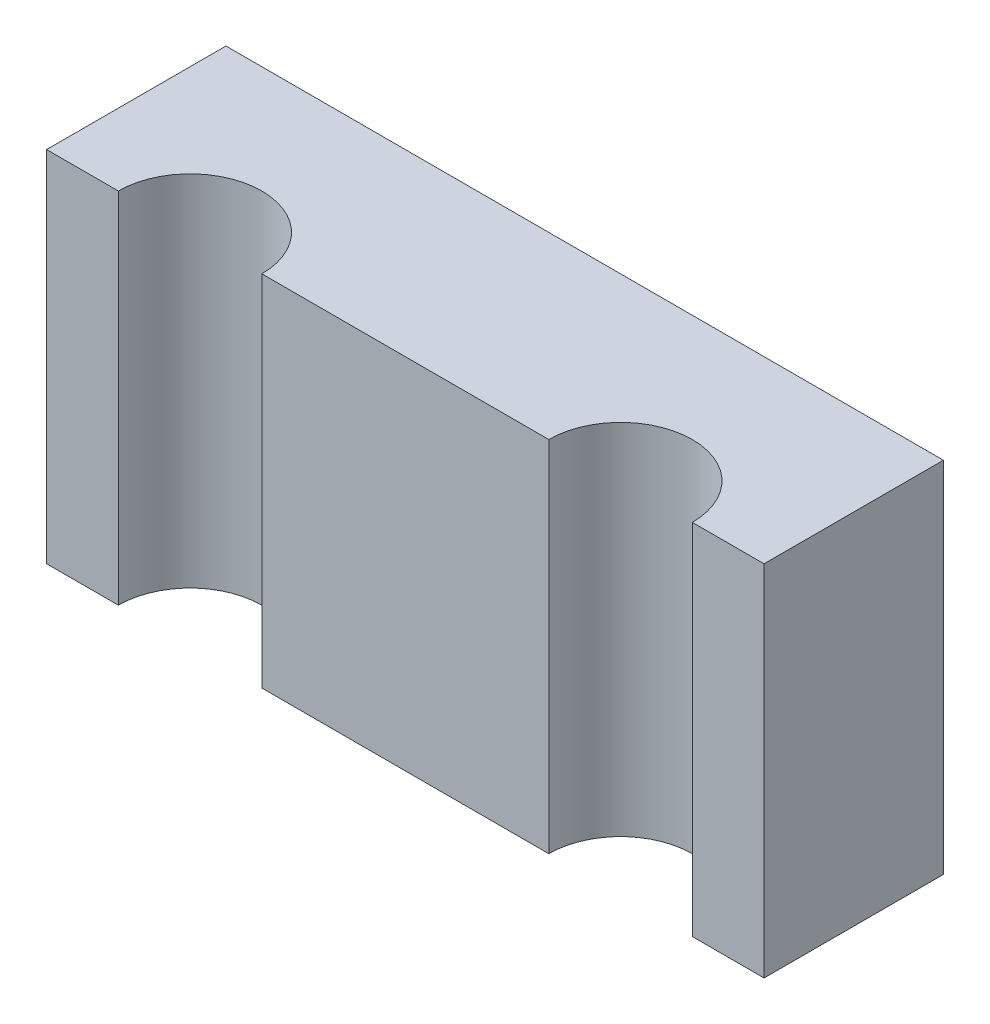
ISO-10303-21;
HEADER;
FILE_DESCRIPTION(('STEP AP214'),'2;1');
FILE_NAME('part.step','',(''),(''),'','','');
FILE_SCHEMA(('AUTOMOTIVE_DESIGN { 1 0 10303 214 1 1 1 1 }'));
ENDSEC;
DATA;
#1=APPLICATION_CONTEXT('core data for automotive mechanical design processes');
#2=APPLICATION_PROTOCOL_DEFINITION('international standard','automotive_design',2000,#1);
#3=PRODUCT_CONTEXT('',#1,'mechanical');
#4=PRODUCT('Part','Part','',(#3));
#5=PRODUCT_RELATED_PRODUCT_CATEGORY('part','',(#4));
#6=PRODUCT_DEFINITION_FORMATION('','',#4);
#7=PRODUCT_DEFINITION_CONTEXT('part definition',#1,'design');
#8=PRODUCT_DEFINITION('design','',#6,#7);
#9=PRODUCT_DEFINITION_SHAPE('','',#8);
#10=(LENGTH_UNIT() NAMED_UNIT(*) SI_UNIT(.MILLI.,.METRE.));
#11=(NAMED_UNIT(*) PLANE_ANGLE_UNIT() SI_UNIT($,.RADIAN.));
#12=(NAMED_UNIT(*) SI_UNIT($,.STERADIAN.) SOLID_ANGLE_UNIT());
#13=UNCERTAINTY_MEASURE_WITH_UNIT(LENGTH_MEASURE(1.E-05),#10,'distance_accuracy_value','');
#14=(GEOMETRIC_REPRESENTATION_CONTEXT(3) GLOBAL_UNCERTAINTY_ASSIGNED_CONTEXT((#13)) GLOBAL_UNIT_ASSIGNED_CONTEXT((#10,
#11,#12)) REPRESENTATION_CONTEXT('',''));
#15=CARTESIAN_POINT('',(0.,0.,0.));
#16=DIRECTION('',(0.,0.,1.));
#17=DIRECTION('',(1.,0.,0.));
#18=AXIS2_PLACEMENT_3D('',#15,#16,#17);
#19=CARTESIAN_POINT('',(0.,0.,10.));
#20=DIRECTION('',(0.,0.,-1.));
#21=DIRECTION('',(-1.,0.,0.));
#22=AXIS2_PLACEMENT_3D('',#19,#20,#21);
#23=PLANE('',#22);
#24=DIRECTION('',(1.,0.,0.));
#25=VECTOR('',#24,1.);
#26=CARTESIAN_POINT('',(4.99999999999997,45.,10.));
#27=LINE('',#26,#25);
#28=CARTESIAN_POINT('',(4.99999999999997,45.,10.));
#29=VERTEX_POINT('',#28);
#30=CARTESIAN_POINT('',(27.5,45.,10.));
#31=VERTEX_POINT('',#30);
#32=EDGE_CURVE('E223',#29,#31,#27,.T.);
#33=ORIENTED_EDGE('',*,*,#32,.T.);
#34=DIRECTION('',(0.,1.,0.));
#35=VECTOR('',#34,1.);
#36=CARTESIAN_POINT('',(27.5,4.99999999999999,10.));
#37=LINE('',#36,#35);
#38=CARTESIAN_POINT('',(27.5,5.,10.));
#39=VERTEX_POINT('',#38);
#40=EDGE_CURVE('E327',#31,#39,#37,.F.);
#41=ORIENTED_EDGE('',*,*,#40,.T.);
#42=DIRECTION('',(-1.,0.,0.));
#43=VECTOR('',#42,1.);
#44=CARTESIAN_POINT('',(4.99999999999997,5.,10.));
#45=LINE('',#44,#43);
#46=CARTESIAN_POINT('',(4.99999999999997,5.,10.));
#47=VERTEX_POINT('',#46);
#48=EDGE_CURVE('E227',#39,#47,#45,.T.);
#49=ORIENTED_EDGE('',*,*,#48,.T.);
#50=DIRECTION('',(0.,1.,0.));
#51=VECTOR('',#50,1.);
#52=CARTESIAN_POINT('',(4.99999999999997,5.,10.));
#53=LINE('',#52,#51);
#54=EDGE_CURVE('E217',#47,#29,#53,.T.);
#55=ORIENTED_EDGE('',*,*,#54,.T.);
#56=EDGE_LOOP('',(#33,#41,#49,#55));
#57=FACE_BOUND('',#56,.T.);
#58=ADVANCED_FACE('F41',(#57),#23,.T.);
#59=CARTESIAN_POINT('',(0.,0.,25.));
#60=DIRECTION('',(0.,0.,-1.));
#61=DIRECTION('',(-1.,0.,0.));
#62=AXIS2_PLACEMENT_3D('',#59,#60,#61);
#63=PLANE('',#62);
#64=DIRECTION('',(1.,0.,0.));
#65=VECTOR('',#64,1.);
#66=CARTESIAN_POINT('',(0.,0.,25.));
#67=LINE('',#66,#65);
#68=CARTESIAN_POINT('',(0.,0.,25.));
#69=VERTEX_POINT('',#68);
#70=CARTESIAN_POINT('',(9.99999999999997,0.,25.));
#71=VERTEX_POINT('',#70);
#72=EDGE_CURVE('E270',#69,#71,#67,.T.);
#73=ORIENTED_EDGE('',*,*,#72,.T.);
#74=DIRECTION('',(0.,1.,0.));
#75=VECTOR('',#74,1.);
#76=CARTESIAN_POINT('',(9.99999999999997,0.,25.));
#77=LINE('',#76,#75);
#78=CARTESIAN_POINT('',(9.99999999999997,50.,25.));
#79=VERTEX_POINT('',#78);
#80=EDGE_CURVE('E323',#71,#79,#77,.T.);
#81=ORIENTED_EDGE('',*,*,#80,.T.);
#82=DIRECTION('',(-1.,0.,0.));
#83=VECTOR('',#82,1.);
#84=CARTESIAN_POINT('',(0.,50.,25.));
#85=LINE('',#84,#83);
#86=CARTESIAN_POINT('',(0.,50.,25.));
#87=VERTEX_POINT('',#86);
#88=EDGE_CURVE('E278',#79,#87,#85,.T.);
#89=ORIENTED_EDGE('',*,*,#88,.T.);
#90=DIRECTION('',(0.,-1.,0.));
#91=VECTOR('',#90,1.);
#92=CARTESIAN_POINT('',(0.,0.,25.));
#93=LINE('',#92,#91);
#94=EDGE_CURVE('E264',#87,#69,#93,.T.);
#95=ORIENTED_EDGE('',*,*,#94,.T.);
#96=EDGE_LOOP('',(#73,#81,#89,#95));
#97=FACE_BOUND('',#96,.T.);
#98=ADVANCED_FACE('F393',(#97),#63,.F.);
#99=CARTESIAN_POINT('',(70.,50.,25.));
#100=VERTEX_POINT('',#99);
#101=CARTESIAN_POINT('',(30.,50.,25.));
#102=VERTEX_POINT('',#101);
#103=EDGE_CURVE('E284',#100,#102,#85,.T.);
#104=ORIENTED_EDGE('',*,*,#103,.T.);
#105=DIRECTION('',(0.,1.,0.));
#106=VECTOR('',#105,1.);
#107=CARTESIAN_POINT('',(30.,0.,25.));
#108=LINE('',#107,#106);
#109=CARTESIAN_POINT('',(30.,0.,25.));
#110=VERTEX_POINT('',#109);
#111=EDGE_CURVE('E319',#102,#110,#108,.F.);
#112=ORIENTED_EDGE('',*,*,#111,.T.);
#113=CARTESIAN_POINT('',(70.,0.,25.));
#114=VERTEX_POINT('',#113);
#115=EDGE_CURVE('E275',#110,#114,#67,.T.);
#116=ORIENTED_EDGE('',*,*,#115,.T.);
#117=DIRECTION('',(0.,1.,0.));
#118=VECTOR('',#117,1.);
#119=CARTESIAN_POINT('',(70.,0.,25.));
#120=LINE('',#119,#118);
#121=EDGE_CURVE('E315',#114,#100,#120,.T.);
#122=ORIENTED_EDGE('',*,*,#121,.T.);
#123=EDGE_LOOP('',(#104,#112,#116,#122));
#124=FACE_BOUND('',#123,.T.);
#125=ADVANCED_FACE('F398',(#124),#63,.F.);
#126=CARTESIAN_POINT('',(0.,0.,25.));
#127=DIRECTION('',(1.,0.,0.));
#128=DIRECTION('',(0.,1.,0.));
#129=AXIS2_PLACEMENT_3D('',#126,#127,#128);
#130=PLANE('',#129);
#131=DIRECTION('',(0.,-1.,0.));
#132=VECTOR('',#131,1.);
#133=CARTESIAN_POINT('',(0.,0.,0.));
#134=LINE('',#133,#132);
#135=CARTESIAN_POINT('',(0.,50.,0.));
#136=VERTEX_POINT('',#135);
#137=CARTESIAN_POINT('',(0.,0.,0.));
#138=VERTEX_POINT('',#137);
#139=EDGE_CURVE('E254',#136,#138,#134,.T.);
#140=ORIENTED_EDGE('',*,*,#139,.T.);
#141=DIRECTION('',(0.,0.,-1.));
#142=VECTOR('',#141,1.);
#143=CARTESIAN_POINT('',(0.,0.,25.));
#144=LINE('',#143,#142);
#145=EDGE_CURVE('E307',#69,#138,#144,.T.);
#146=ORIENTED_EDGE('',*,*,#145,.F.);
#147=ORIENTED_EDGE('',*,*,#94,.F.);
#148=DIRECTION('',(0.,0.,-1.));
#149=VECTOR('',#148,1.);
#150=CARTESIAN_POINT('',(0.,50.,25.));
#151=LINE('',#150,#149);
#152=EDGE_CURVE('E283',#87,#136,#151,.T.);
#153=ORIENTED_EDGE('',*,*,#152,.T.);
#154=EDGE_LOOP('',(#140,#146,#147,#153));
#155=FACE_BOUND('',#154,.T.);
#156=ADVANCED_FACE('F440',(#155),#130,.F.);
#157=CARTESIAN_POINT('',(0.,0.,25.));
#158=DIRECTION('',(0.,1.,0.));
#159=DIRECTION('',(0.,0.,1.));
#160=AXIS2_PLACEMENT_3D('',#157,#158,#159);
#161=PLANE('',#160);
#162=ORIENTED_EDGE('',*,*,#115,.F.);
#163=CARTESIAN_POINT('',(20.,0.,25.));
#164=DIRECTION('',(0.,1.,0.));
#165=DIRECTION('',(0.,0.,1.));
#166=AXIS2_PLACEMENT_3D('',#163,#164,#165);
#167=CIRCLE('',#166,10.);
#168=EDGE_CURVE('E250',#110,#71,#167,.T.);
#169=ORIENTED_EDGE('',*,*,#168,.T.);
#170=ORIENTED_EDGE('',*,*,#72,.F.);
#171=ORIENTED_EDGE('',*,*,#145,.T.);
#172=DIRECTION('',(1.,0.,0.));
#173=VECTOR('',#172,1.);
#174=CARTESIAN_POINT('',(0.,0.,0.));
#175=LINE('',#174,#173);
#176=CARTESIAN_POINT('',(100.,0.,0.));
#177=VERTEX_POINT('',#176);
#178=EDGE_CURVE('E288',#138,#177,#175,.T.);
#179=ORIENTED_EDGE('',*,*,#178,.T.);
#180=DIRECTION('',(0.,0.,-1.));
#181=VECTOR('',#180,1.);
#182=CARTESIAN_POINT('',(100.,0.,25.));
#183=LINE('',#182,#181);
#184=CARTESIAN_POINT('',(100.,0.,25.));
#185=VERTEX_POINT('',#184);
#186=EDGE_CURVE('E303',#185,#177,#183,.T.);
#187=ORIENTED_EDGE('',*,*,#186,.F.);
#188=CARTESIAN_POINT('',(90.,0.,25.));
#189=VERTEX_POINT('',#188);
#190=EDGE_CURVE('E268',#189,#185,#67,.T.);
#191=ORIENTED_EDGE('',*,*,#190,.F.);
#192=CARTESIAN_POINT('',(80.,0.,25.));
#193=DIRECTION('',(0.,1.,0.));
#194=DIRECTION('',(0.,0.,1.));
#195=AXIS2_PLACEMENT_3D('',#192,#193,#194);
#196=CIRCLE('',#195,9.99999999999999);
#197=EDGE_CURVE('E258',#189,#114,#196,.T.);
#198=ORIENTED_EDGE('',*,*,#197,.T.);
#199=EDGE_LOOP('',(#162,#169,#170,#171,#179,#187,#191,#198));
#200=FACE_BOUND('',#199,.T.);
#201=ADVANCED_FACE('F436',(#200),#161,.F.);
#202=CARTESIAN_POINT('',(100.,0.,25.));
#203=DIRECTION('',(-1.,0.,0.));
#204=DIRECTION('',(0.,-1.,0.));
#205=AXIS2_PLACEMENT_3D('',#202,#203,#204);
#206=PLANE('',#205);
#207=DIRECTION('',(0.,1.,0.));
#208=VECTOR('',#207,1.);
#209=CARTESIAN_POINT('',(100.,0.,0.));
#210=LINE('',#209,#208);
#211=CARTESIAN_POINT('',(100.,50.,0.));
#212=VERTEX_POINT('',#211);
#213=EDGE_CURVE('E291',#177,#212,#210,.T.);
#214=ORIENTED_EDGE('',*,*,#213,.T.);
#215=DIRECTION('',(0.,0.,-1.));
#216=VECTOR('',#215,1.);
#217=CARTESIAN_POINT('',(100.,50.,25.));
#218=LINE('',#217,#216);
#219=CARTESIAN_POINT('',(100.,50.,25.));
#220=VERTEX_POINT('',#219);
#221=EDGE_CURVE('E299',#220,#212,#218,.T.);
#222=ORIENTED_EDGE('',*,*,#221,.F.);
#223=DIRECTION('',(0.,1.,0.));
#224=VECTOR('',#223,1.);
#225=CARTESIAN_POINT('',(100.,0.,25.));
#226=LINE('',#225,#224);
#227=EDGE_CURVE('E274',#185,#220,#226,.T.);
#228=ORIENTED_EDGE('',*,*,#227,.F.);
#229=ORIENTED_EDGE('',*,*,#186,.T.);
#230=EDGE_LOOP('',(#214,#222,#228,#229));
#231=FACE_BOUND('',#230,.T.);
#232=ADVANCED_FACE('F432',(#231),#206,.F.);
#233=CARTESIAN_POINT('',(0.,50.,25.));
#234=DIRECTION('',(0.,-1.,0.));
#235=DIRECTION('',(0.,0.,-1.));
#236=AXIS2_PLACEMENT_3D('',#233,#234,#235);
#237=PLANE('',#236);
#238=ORIENTED_EDGE('',*,*,#88,.F.);
#239=CARTESIAN_POINT('',(20.,50.,25.));
#240=DIRECTION('',(0.,1.,0.));
#241=DIRECTION('',(0.,0.,1.));
#242=AXIS2_PLACEMENT_3D('',#239,#240,#241);
#243=CIRCLE('',#242,10.);
#244=EDGE_CURVE('E255',#102,#79,#243,.T.);
#245=ORIENTED_EDGE('',*,*,#244,.F.);
#246=ORIENTED_EDGE('',*,*,#103,.F.);
#247=CARTESIAN_POINT('',(80.,50.,25.));
#248=DIRECTION('',(0.,1.,0.));
#249=DIRECTION('',(0.,0.,1.));
#250=AXIS2_PLACEMENT_3D('',#247,#248,#249);
#251=CIRCLE('',#250,9.99999999999999);
#252=CARTESIAN_POINT('',(90.,50.,25.));
#253=VERTEX_POINT('',#252);
#254=EDGE_CURVE('E243',#253,#100,#251,.T.);
#255=ORIENTED_EDGE('',*,*,#254,.F.);
#256=EDGE_CURVE('E279',#220,#253,#85,.T.);
#257=ORIENTED_EDGE('',*,*,#256,.F.);
#258=ORIENTED_EDGE('',*,*,#221,.T.);
#259=DIRECTION('',(-1.,0.,0.));
#260=VECTOR('',#259,1.);
#261=CARTESIAN_POINT('',(0.,50.,0.));
#262=LINE('',#261,#260);
#263=EDGE_CURVE('E269',#212,#136,#262,.T.);
#264=ORIENTED_EDGE('',*,*,#263,.T.);
#265=ORIENTED_EDGE('',*,*,#152,.F.);
#266=EDGE_LOOP('',(#238,#245,#246,#255,#257,#258,#264,#265));
#267=FACE_BOUND('',#266,.T.);
#268=ADVANCED_FACE('F426',(#267),#237,.F.);
#269=ORIENTED_EDGE('',*,*,#256,.T.);
#270=DIRECTION('',(0.,1.,0.));
#271=VECTOR('',#270,1.);
#272=CARTESIAN_POINT('',(90.,0.,25.));
#273=LINE('',#272,#271);
#274=EDGE_CURVE('E311',#253,#189,#273,.F.);
#275=ORIENTED_EDGE('',*,*,#274,.T.);
#276=ORIENTED_EDGE('',*,*,#190,.T.);
#277=ORIENTED_EDGE('',*,*,#227,.T.);
#278=EDGE_LOOP('',(#269,#275,#276,#277));
#279=FACE_BOUND('',#278,.T.);
#280=ADVANCED_FACE('F401',(#279),#63,.F.);
#281=CARTESIAN_POINT('',(0.,0.,0.));
#282=DIRECTION('',(0.,0.,-1.));
#283=DIRECTION('',(-1.,0.,0.));
#284=AXIS2_PLACEMENT_3D('',#281,#282,#283);
#285=PLANE('',#284);
#286=DIRECTION('',(0.,1.,0.));
#287=VECTOR('',#286,1.);
#288=CARTESIAN_POINT('',(4.99999999999997,5.,0.));
#289=LINE('',#288,#287);
#290=CARTESIAN_POINT('',(4.99999999999997,5.,0.));
#291=VERTEX_POINT('',#290);
#292=CARTESIAN_POINT('',(4.99999999999997,45.,0.));
#293=VERTEX_POINT('',#292);
#294=EDGE_CURVE('E216',#291,#293,#289,.T.);
#295=ORIENTED_EDGE('',*,*,#294,.F.);
#296=DIRECTION('',(-1.,0.,0.));
#297=VECTOR('',#296,1.);
#298=CARTESIAN_POINT('',(4.99999999999997,5.,0.));
#299=LINE('',#298,#297);
#300=CARTESIAN_POINT('',(95.,4.99999999999999,0.));
#301=VERTEX_POINT('',#300);
#302=EDGE_CURVE('E222',#301,#291,#299,.T.);
#303=ORIENTED_EDGE('',*,*,#302,.F.);
#304=DIRECTION('',(0.,-1.,0.));
#305=VECTOR('',#304,1.);
#306=CARTESIAN_POINT('',(95.,4.99999999999999,0.));
#307=LINE('',#306,#305);
#308=CARTESIAN_POINT('',(95.,45.,0.));
#309=VERTEX_POINT('',#308);
#310=EDGE_CURVE('E173',#309,#301,#307,.T.);
#311=ORIENTED_EDGE('',*,*,#310,.F.);
#312=DIRECTION('',(1.,0.,0.));
#313=VECTOR('',#312,1.);
#314=CARTESIAN_POINT('',(4.99999999999997,45.,0.));
#315=LINE('',#314,#313);
#316=EDGE_CURVE('E234',#293,#309,#315,.T.);
#317=ORIENTED_EDGE('',*,*,#316,.F.);
#318=EDGE_LOOP('',(#295,#303,#311,#317));
#319=FACE_BOUND('',#318,.T.);
#320=ORIENTED_EDGE('',*,*,#139,.F.);
#321=ORIENTED_EDGE('',*,*,#263,.F.);
#322=ORIENTED_EDGE('',*,*,#213,.F.);
#323=ORIENTED_EDGE('',*,*,#178,.F.);
#324=EDGE_LOOP('',(#320,#321,#322,#323));
#325=FACE_BOUND('',#324,.T.);
#326=ADVANCED_FACE('F365',(#319,#325),#285,.T.);
#327=CARTESIAN_POINT('',(80.,0.,25.));
#328=DIRECTION('',(0.,1.,0.));
#329=DIRECTION('',(0.,0.,1.));
#330=AXIS2_PLACEMENT_3D('',#327,#328,#329);
#331=CYLINDRICAL_SURFACE('',#330,9.99999999999999);
#332=ORIENTED_EDGE('',*,*,#197,.F.);
#333=ORIENTED_EDGE('',*,*,#274,.F.);
#334=ORIENTED_EDGE('',*,*,#254,.T.);
#335=ORIENTED_EDGE('',*,*,#121,.F.);
#336=EDGE_LOOP('',(#332,#333,#334,#335));
#337=FACE_BOUND('',#336,.T.);
#338=ADVANCED_FACE('F420',(#337),#331,.F.);
#339=CARTESIAN_POINT('',(20.,0.,25.));
#340=DIRECTION('',(0.,1.,0.));
#341=DIRECTION('',(0.,0.,1.));
#342=AXIS2_PLACEMENT_3D('',#339,#340,#341);
#343=CYLINDRICAL_SURFACE('',#342,10.);
#344=ORIENTED_EDGE('',*,*,#168,.F.);
#345=ORIENTED_EDGE('',*,*,#111,.F.);
#346=ORIENTED_EDGE('',*,*,#244,.T.);
#347=ORIENTED_EDGE('',*,*,#80,.F.);
#348=EDGE_LOOP('',(#344,#345,#346,#347));
#349=FACE_BOUND('',#348,.T.);
#350=ADVANCED_FACE('F417',(#349),#343,.F.);
#351=CARTESIAN_POINT('',(4.99999999999997,5.,10.));
#352=DIRECTION('',(-1.,0.,0.));
#353=DIRECTION('',(0.,0.,1.));
#354=AXIS2_PLACEMENT_3D('',#351,#352,#353);
#355=PLANE('',#354);
#356=ORIENTED_EDGE('',*,*,#294,.T.);
#357=DIRECTION('',(0.,0.,-1.));
#358=VECTOR('',#357,1.);
#359=CARTESIAN_POINT('',(4.99999999999997,45.,10.));
#360=LINE('',#359,#358);
#361=EDGE_CURVE('E231',#29,#293,#360,.T.);
#362=ORIENTED_EDGE('',*,*,#361,.F.);
#363=ORIENTED_EDGE('',*,*,#54,.F.);
#364=DIRECTION('',(0.,0.,-1.));
#365=VECTOR('',#364,1.);
#366=CARTESIAN_POINT('',(4.99999999999997,5.,10.));
#367=LINE('',#366,#365);
#368=EDGE_CURVE('E178',#47,#291,#367,.T.);
#369=ORIENTED_EDGE('',*,*,#368,.T.);
#370=EDGE_LOOP('',(#356,#362,#363,#369));
#371=FACE_BOUND('',#370,.T.);
#372=ADVANCED_FACE('F372',(#371),#355,.F.);
#373=CARTESIAN_POINT('',(4.99999999999997,5.,10.));
#374=DIRECTION('',(0.,-1.,0.));
#375=DIRECTION('',(1.,0.,0.));
#376=AXIS2_PLACEMENT_3D('',#373,#374,#375);
#377=PLANE('',#376);
#378=ORIENTED_EDGE('',*,*,#302,.T.);
#379=ORIENTED_EDGE('',*,*,#368,.F.);
#380=ORIENTED_EDGE('',*,*,#48,.F.);
#381=CARTESIAN_POINT('',(27.5,5.,20.));
#382=DIRECTION('',(0.,-1.,0.));
#383=DIRECTION('',(1.,0.,0.));
#384=AXIS2_PLACEMENT_3D('',#381,#382,#383);
#385=CIRCLE('',#384,10.);
#386=CARTESIAN_POINT('',(37.5,4.99999999999999,20.));
#387=VERTEX_POINT('',#386);
#388=EDGE_CURVE('E333',#39,#387,#385,.T.);
#389=ORIENTED_EDGE('',*,*,#388,.T.);
#390=DIRECTION('',(-1.,0.,0.));
#391=VECTOR('',#390,1.);
#392=CARTESIAN_POINT('',(37.5,4.99999999999999,20.));
#393=LINE('',#392,#391);
#394=CARTESIAN_POINT('',(62.5,4.99999999999999,20.));
#395=VERTEX_POINT('',#394);
#396=EDGE_CURVE('E212',#395,#387,#393,.T.);
#397=ORIENTED_EDGE('',*,*,#396,.F.);
#398=CARTESIAN_POINT('',(72.5,4.99999999999999,20.));
#399=DIRECTION('',(0.,-1.,0.));
#400=DIRECTION('',(1.,0.,0.));
#401=AXIS2_PLACEMENT_3D('',#398,#399,#400);
#402=CIRCLE('',#401,10.);
#403=CARTESIAN_POINT('',(72.5,4.99999999999999,10.));
#404=VERTEX_POINT('',#403);
#405=EDGE_CURVE('E339',#395,#404,#402,.T.);
#406=ORIENTED_EDGE('',*,*,#405,.T.);
#407=CARTESIAN_POINT('',(83.,4.99999999999999,10.));
#408=VERTEX_POINT('',#407);
#409=EDGE_CURVE('E228',#408,#404,#45,.T.);
#410=ORIENTED_EDGE('',*,*,#409,.F.);
#411=CARTESIAN_POINT('',(83.,4.99999999999999,20.));
#412=DIRECTION('',(0.,-1.,0.));
#413=DIRECTION('',(1.,0.,0.));
#414=AXIS2_PLACEMENT_3D('',#411,#412,#413);
#415=CIRCLE('',#414,10.);
#416=CARTESIAN_POINT('',(93.,4.99999999999999,20.));
#417=VERTEX_POINT('',#416);
#418=EDGE_CURVE('E11',#408,#417,#415,.T.);
#419=ORIENTED_EDGE('',*,*,#418,.T.);
#420=DIRECTION('',(-1.,0.,0.));
#421=VECTOR('',#420,1.);
#422=CARTESIAN_POINT('',(95.,4.99999999999999,20.));
#423=LINE('',#422,#421);
#424=CARTESIAN_POINT('',(95.,4.99999999999999,20.));
#425=VERTEX_POINT('',#424);
#426=EDGE_CURVE('E182',#425,#417,#423,.T.);
#427=ORIENTED_EDGE('',*,*,#426,.F.);
#428=DIRECTION('',(0.,0.,-1.));
#429=VECTOR('',#428,1.);
#430=CARTESIAN_POINT('',(95.,4.99999999999999,10.));
#431=LINE('',#430,#429);
#432=EDGE_CURVE('E166',#425,#301,#431,.T.);
#433=ORIENTED_EDGE('',*,*,#432,.T.);
#434=EDGE_LOOP('',(#378,#379,#380,#389,#397,#406,#410,#419,#427,#433));
#435=FACE_BOUND('',#434,.T.);
#436=ADVANCED_FACE('F183',(#435),#377,.F.);
#437=CARTESIAN_POINT('',(95.,4.99999999999999,10.));
#438=DIRECTION('',(1.,0.,0.));
#439=DIRECTION('',(0.,0.,-1.));
#440=AXIS2_PLACEMENT_3D('',#437,#438,#439);
#441=PLANE('',#440);
#442=ORIENTED_EDGE('',*,*,#310,.T.);
#443=ORIENTED_EDGE('',*,*,#432,.F.);
#444=DIRECTION('',(0.,-1.,0.));
#445=VECTOR('',#444,1.);
#446=CARTESIAN_POINT('',(95.,45.,20.));
#447=LINE('',#446,#445);
#448=CARTESIAN_POINT('',(95.,45.,20.));
#449=VERTEX_POINT('',#448);
#450=EDGE_CURVE('E170',#449,#425,#447,.T.);
#451=ORIENTED_EDGE('',*,*,#450,.F.);
#452=DIRECTION('',(0.,0.,-1.));
#453=VECTOR('',#452,1.);
#454=CARTESIAN_POINT('',(95.,45.,10.));
#455=LINE('',#454,#453);
#456=EDGE_CURVE('E179',#449,#309,#455,.T.);
#457=ORIENTED_EDGE('',*,*,#456,.T.);
#458=EDGE_LOOP('',(#442,#443,#451,#457));
#459=FACE_BOUND('',#458,.T.);
#460=ADVANCED_FACE('F168',(#459),#441,.F.);
#461=CARTESIAN_POINT('',(4.99999999999997,45.,10.));
#462=DIRECTION('',(0.,1.,0.));
#463=DIRECTION('',(-1.,0.,0.));
#464=AXIS2_PLACEMENT_3D('',#461,#462,#463);
#465=PLANE('',#464);
#466=ORIENTED_EDGE('',*,*,#316,.T.);
#467=ORIENTED_EDGE('',*,*,#456,.F.);
#468=DIRECTION('',(1.,0.,0.));
#469=VECTOR('',#468,1.);
#470=CARTESIAN_POINT('',(95.,45.,20.));
#471=LINE('',#470,#469);
#472=CARTESIAN_POINT('',(93.,45.,20.));
#473=VERTEX_POINT('',#472);
#474=EDGE_CURVE('E192',#473,#449,#471,.T.);
#475=ORIENTED_EDGE('',*,*,#474,.F.);
#476=CARTESIAN_POINT('',(83.,45.,20.));
#477=DIRECTION('',(0.,1.,0.));
#478=DIRECTION('',(-1.,0.,0.));
#479=AXIS2_PLACEMENT_3D('',#476,#477,#478);
#480=CIRCLE('',#479,10.);
#481=CARTESIAN_POINT('',(83.,45.,10.));
#482=VERTEX_POINT('',#481);
#483=EDGE_CURVE('E50',#473,#482,#480,.T.);
#484=ORIENTED_EDGE('',*,*,#483,.T.);
#485=CARTESIAN_POINT('',(72.5,45.,10.));
#486=VERTEX_POINT('',#485);
#487=EDGE_CURVE('E221',#486,#482,#27,.T.);
#488=ORIENTED_EDGE('',*,*,#487,.F.);
#489=CARTESIAN_POINT('',(72.5,45.,20.));
#490=DIRECTION('',(0.,1.,0.));
#491=DIRECTION('',(-1.,0.,0.));
#492=AXIS2_PLACEMENT_3D('',#489,#490,#491);
#493=CIRCLE('',#492,10.);
#494=CARTESIAN_POINT('',(62.5,45.,20.));
#495=VERTEX_POINT('',#494);
#496=EDGE_CURVE('E343',#486,#495,#493,.T.);
#497=ORIENTED_EDGE('',*,*,#496,.T.);
#498=DIRECTION('',(1.,0.,0.));
#499=VECTOR('',#498,1.);
#500=CARTESIAN_POINT('',(37.5,45.,20.));
#501=LINE('',#500,#499);
#502=CARTESIAN_POINT('',(37.5,45.,20.));
#503=VERTEX_POINT('',#502);
#504=EDGE_CURVE('E204',#503,#495,#501,.T.);
#505=ORIENTED_EDGE('',*,*,#504,.F.);
#506=CARTESIAN_POINT('',(27.5,45.,20.));
#507=DIRECTION('',(0.,1.,0.));
#508=DIRECTION('',(-1.,0.,0.));
#509=AXIS2_PLACEMENT_3D('',#506,#507,#508);
#510=CIRCLE('',#509,10.);
#511=EDGE_CURVE('E330',#503,#31,#510,.T.);
#512=ORIENTED_EDGE('',*,*,#511,.T.);
#513=ORIENTED_EDGE('',*,*,#32,.F.);
#514=ORIENTED_EDGE('',*,*,#361,.T.);
#515=EDGE_LOOP('',(#466,#467,#475,#484,#488,#497,#505,#512,#513,#514));
#516=FACE_BOUND('',#515,.T.);
#517=ADVANCED_FACE('F360',(#516),#465,.F.);
#518=ORIENTED_EDGE('',*,*,#487,.T.);
#519=DIRECTION('',(0.,1.,0.));
#520=VECTOR('',#519,1.);
#521=CARTESIAN_POINT('',(83.,4.99999999999999,10.));
#522=LINE('',#521,#520);
#523=EDGE_CURVE('E63',#482,#408,#522,.F.);
#524=ORIENTED_EDGE('',*,*,#523,.T.);
#525=ORIENTED_EDGE('',*,*,#409,.T.);
#526=DIRECTION('',(0.,-1.,0.));
#527=VECTOR('',#526,1.);
#528=CARTESIAN_POINT('',(72.5,45.,10.));
#529=LINE('',#528,#527);
#530=EDGE_CURVE('E336',#404,#486,#529,.F.);
#531=ORIENTED_EDGE('',*,*,#530,.T.);
#532=EDGE_LOOP('',(#518,#524,#525,#531));
#533=FACE_BOUND('',#532,.T.);
#534=ADVANCED_FACE('F356',(#533),#23,.T.);
#535=CARTESIAN_POINT('',(0.,0.,20.));
#536=DIRECTION('',(0.,0.,-1.));
#537=DIRECTION('',(-1.,0.,0.));
#538=AXIS2_PLACEMENT_3D('',#535,#536,#537);
#539=PLANE('',#538);
#540=DIRECTION('',(0.,1.,0.));
#541=VECTOR('',#540,1.);
#542=CARTESIAN_POINT('',(37.5,4.99999999999999,20.));
#543=LINE('',#542,#541);
#544=EDGE_CURVE('E200',#387,#503,#543,.T.);
#545=ORIENTED_EDGE('',*,*,#544,.T.);
#546=ORIENTED_EDGE('',*,*,#504,.T.);
#547=DIRECTION('',(0.,-1.,0.));
#548=VECTOR('',#547,1.);
#549=CARTESIAN_POINT('',(62.5,4.99999999999999,20.));
#550=LINE('',#549,#548);
#551=EDGE_CURVE('E208',#495,#395,#550,.T.);
#552=ORIENTED_EDGE('',*,*,#551,.T.);
#553=ORIENTED_EDGE('',*,*,#396,.T.);
#554=EDGE_LOOP('',(#545,#546,#552,#553));
#555=FACE_BOUND('',#554,.T.);
#556=ADVANCED_FACE('F381',(#555),#539,.T.);
#557=CARTESIAN_POINT('',(27.5,4.99999999999999,20.));
#558=DIRECTION('',(0.,-1.,0.));
#559=DIRECTION('',(0.,0.,-1.));
#560=AXIS2_PLACEMENT_3D('',#557,#558,#559);
#561=CYLINDRICAL_SURFACE('',#560,10.);
#562=ORIENTED_EDGE('',*,*,#388,.F.);
#563=ORIENTED_EDGE('',*,*,#40,.F.);
#564=ORIENTED_EDGE('',*,*,#511,.F.);
#565=ORIENTED_EDGE('',*,*,#544,.F.);
#566=EDGE_LOOP('',(#562,#563,#564,#565));
#567=FACE_BOUND('',#566,.T.);
#568=ADVANCED_FACE('F376',(#567),#561,.T.);
#569=CARTESIAN_POINT('',(72.5,4.99999999999999,20.));
#570=DIRECTION('',(0.,1.,0.));
#571=DIRECTION('',(0.,0.,1.));
#572=AXIS2_PLACEMENT_3D('',#569,#570,#571);
#573=CYLINDRICAL_SURFACE('',#572,10.);
#574=ORIENTED_EDGE('',*,*,#496,.F.);
#575=ORIENTED_EDGE('',*,*,#530,.F.);
#576=ORIENTED_EDGE('',*,*,#405,.F.);
#577=ORIENTED_EDGE('',*,*,#551,.F.);
#578=EDGE_LOOP('',(#574,#575,#576,#577));
#579=FACE_BOUND('',#578,.T.);
#580=ADVANCED_FACE('F384',(#579),#573,.T.);
#581=CARTESIAN_POINT('',(0.,0.,20.));
#582=DIRECTION('',(0.,0.,-1.));
#583=DIRECTION('',(-1.,0.,0.));
#584=AXIS2_PLACEMENT_3D('',#581,#582,#583);
#585=PLANE('',#584);
#586=ORIENTED_EDGE('',*,*,#450,.T.);
#587=ORIENTED_EDGE('',*,*,#426,.T.);
#588=DIRECTION('',(0.,1.,0.));
#589=VECTOR('',#588,1.);
#590=CARTESIAN_POINT('',(93.,45.,20.));
#591=LINE('',#590,#589);
#592=EDGE_CURVE('E189',#417,#473,#591,.T.);
#593=ORIENTED_EDGE('',*,*,#592,.T.);
#594=ORIENTED_EDGE('',*,*,#474,.T.);
#595=EDGE_LOOP('',(#586,#587,#593,#594));
#596=FACE_BOUND('',#595,.T.);
#597=ADVANCED_FACE('F191',(#596),#585,.T.);
#598=CARTESIAN_POINT('',(83.,45.,20.));
#599=DIRECTION('',(0.,-1.,0.));
#600=DIRECTION('',(0.,0.,-1.));
#601=AXIS2_PLACEMENT_3D('',#598,#599,#600);
#602=CYLINDRICAL_SURFACE('',#601,10.);
#603=ORIENTED_EDGE('',*,*,#418,.F.);
#604=ORIENTED_EDGE('',*,*,#523,.F.);
#605=ORIENTED_EDGE('',*,*,#483,.F.);
#606=ORIENTED_EDGE('',*,*,#592,.F.);
#607=EDGE_LOOP('',(#603,#604,#605,#606));
#608=FACE_BOUND('',#607,.T.);
#609=ADVANCED_FACE('F43',(#608),#602,.T.);
#610=CLOSED_SHELL('',(#58,#98,#125,#156,#201,#232,#268,#280,#326,#338,#350,#372,#436,#460,#517,
#534,#556,#568,#580,#597,#609));
#611=MANIFOLD_SOLID_BREP('B2',#610);
#612=ADVANCED_BREP_SHAPE_REPRESENTATION('',(#18,#611),#14);
#613=SHAPE_DEFINITION_REPRESENTATION(#9,#612);
ENDSEC;
END-ISO-10303-21;
